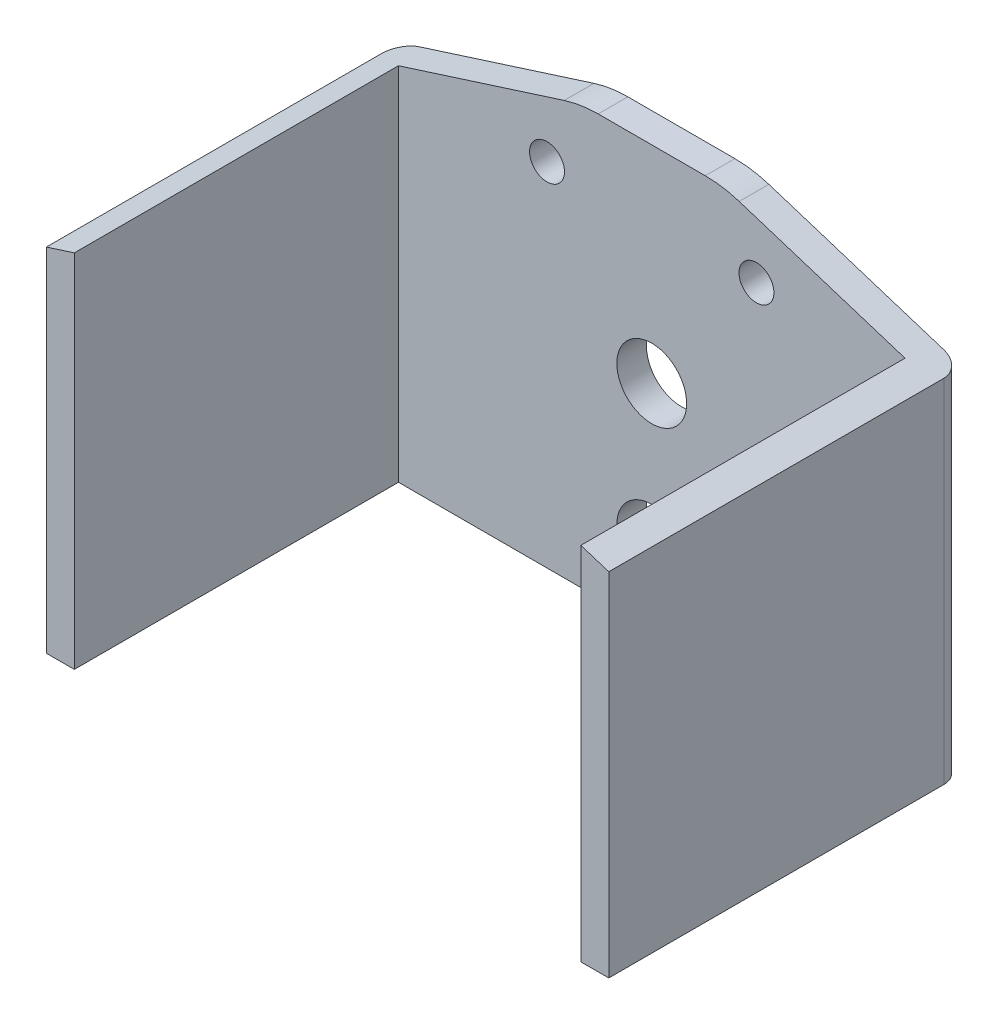
ISO-10303-21;
HEADER;
FILE_DESCRIPTION(('STEP AP214'),'2;1');
FILE_NAME('part.step','',(''),(''),'','','');
FILE_SCHEMA(('AUTOMOTIVE_DESIGN { 1 0 10303 214 1 1 1 1 }'));
ENDSEC;
DATA;
#1=APPLICATION_CONTEXT('core data for automotive mechanical design processes');
#2=APPLICATION_PROTOCOL_DEFINITION('international standard','automotive_design',2000,#1);
#3=PRODUCT_CONTEXT('',#1,'mechanical');
#4=PRODUCT('Part','Part','',(#3));
#5=PRODUCT_RELATED_PRODUCT_CATEGORY('part','',(#4));
#6=PRODUCT_DEFINITION_FORMATION('','',#4);
#7=PRODUCT_DEFINITION_CONTEXT('part definition',#1,'design');
#8=PRODUCT_DEFINITION('design','',#6,#7);
#9=PRODUCT_DEFINITION_SHAPE('','',#8);
#10=(LENGTH_UNIT() NAMED_UNIT(*) SI_UNIT(.MILLI.,.METRE.));
#11=(NAMED_UNIT(*) PLANE_ANGLE_UNIT() SI_UNIT($,.RADIAN.));
#12=(NAMED_UNIT(*) SI_UNIT($,.STERADIAN.) SOLID_ANGLE_UNIT());
#13=UNCERTAINTY_MEASURE_WITH_UNIT(LENGTH_MEASURE(1.E-05),#10,'distance_accuracy_value','');
#14=(GEOMETRIC_REPRESENTATION_CONTEXT(3) GLOBAL_UNCERTAINTY_ASSIGNED_CONTEXT((#13)) GLOBAL_UNIT_ASSIGNED_CONTEXT((#10,
#11,#12)) REPRESENTATION_CONTEXT('',''));
#15=CARTESIAN_POINT('',(0.,0.,0.));
#16=DIRECTION('',(0.,0.,1.));
#17=DIRECTION('',(1.,0.,0.));
#18=AXIS2_PLACEMENT_3D('',#15,#16,#17);
#19=CARTESIAN_POINT('',(-11.5187275160441,19.05,16.0907323942963));
#20=DIRECTION('',(-1.,0.,0.));
#21=DIRECTION('',(0.,0.,1.));
#22=AXIS2_PLACEMENT_3D('',#19,#20,#21);
#23=PLANE('',#22);
#24=DIRECTION('',(0.,-1.,0.));
#25=VECTOR('',#24,1.);
#26=CARTESIAN_POINT('',(-11.5187275160441,19.05,1.34814475605444));
#27=LINE('',#26,#25);
#28=CARTESIAN_POINT('',(-11.5187275160441,16.4067377666655,1.34814475605444));
#29=VERTEX_POINT('',#28);
#30=CARTESIAN_POINT('',(-11.5187275160441,0.,1.34814475605444));
#31=VERTEX_POINT('',#30);
#32=EDGE_CURVE('E187',#29,#31,#27,.T.);
#33=ORIENTED_EDGE('',*,*,#32,.F.);
#34=DIRECTION('',(0.,0.,1.));
#35=VECTOR('',#34,1.);
#36=CARTESIAN_POINT('',(-11.5187275160441,16.4067377666655,16.0907323942963));
#37=LINE('',#36,#35);
#38=CARTESIAN_POINT('',(-11.5187275160441,16.4067377666655,16.0907323942963));
#39=VERTEX_POINT('',#38);
#40=EDGE_CURVE('E242',#29,#39,#37,.T.);
#41=ORIENTED_EDGE('',*,*,#40,.T.);
#42=DIRECTION('',(0.,-1.,0.));
#43=VECTOR('',#42,1.);
#44=CARTESIAN_POINT('',(-11.5187275160441,19.05,16.0907323942963));
#45=LINE('',#44,#43);
#46=CARTESIAN_POINT('',(-11.5187275160441,0.,16.0907323942963));
#47=VERTEX_POINT('',#46);
#48=EDGE_CURVE('E161',#39,#47,#45,.T.);
#49=ORIENTED_EDGE('',*,*,#48,.T.);
#50=DIRECTION('',(0.,0.,-1.));
#51=VECTOR('',#50,1.);
#52=CARTESIAN_POINT('',(-11.5187275160441,0.,16.0907323942963));
#53=LINE('',#52,#51);
#54=EDGE_CURVE('E255',#47,#31,#53,.T.);
#55=ORIENTED_EDGE('',*,*,#54,.T.);
#56=EDGE_LOOP('',(#33,#41,#49,#55));
#57=FACE_BOUND('',#56,.T.);
#58=ADVANCED_FACE('F42',(#57),#23,.F.);
#59=CARTESIAN_POINT('',(-11.5187275160441,19.05,1.34814475605444));
#60=DIRECTION('',(0.,0.,-1.));
#61=DIRECTION('',(-1.,0.,0.));
#62=AXIS2_PLACEMENT_3D('',#59,#60,#61);
#63=PLANE('',#62);
#64=CARTESIAN_POINT('',(4.7625,16.002,1.34814475605444));
#65=DIRECTION('',(0.,0.,-1.));
#66=DIRECTION('',(-1.,0.,0.));
#67=AXIS2_PLACEMENT_3D('',#64,#65,#66);
#68=CIRCLE('',#67,0.79375);
#69=CARTESIAN_POINT('',(3.96875,16.002,1.34814475605444));
#70=VERTEX_POINT('',#69);
#71=EDGE_CURVE('E253',#70,#70,#68,.T.);
#72=ORIENTED_EDGE('',*,*,#71,.T.);
#73=EDGE_LOOP('',(#72));
#74=FACE_BOUND('',#73,.T.);
#75=CARTESIAN_POINT('',(0.,3.30200000000001,1.34814475605444));
#76=DIRECTION('',(0.,0.,-1.));
#77=DIRECTION('',(-1.,0.,0.));
#78=AXIS2_PLACEMENT_3D('',#75,#76,#77);
#79=CIRCLE('',#78,1.5875);
#80=CARTESIAN_POINT('',(-1.5875,3.30200000000001,1.34814475605444));
#81=VERTEX_POINT('',#80);
#82=EDGE_CURVE('E250',#81,#81,#79,.T.);
#83=ORIENTED_EDGE('',*,*,#82,.T.);
#84=EDGE_LOOP('',(#83));
#85=FACE_BOUND('',#84,.T.);
#86=CARTESIAN_POINT('',(0.,9.652,1.34814475605444));
#87=DIRECTION('',(0.,0.,-1.));
#88=DIRECTION('',(-1.,0.,0.));
#89=AXIS2_PLACEMENT_3D('',#86,#87,#88);
#90=CIRCLE('',#89,1.5875);
#91=CARTESIAN_POINT('',(-1.5875,9.652,1.34814475605444));
#92=VERTEX_POINT('',#91);
#93=EDGE_CURVE('E247',#92,#92,#90,.T.);
#94=ORIENTED_EDGE('',*,*,#93,.T.);
#95=EDGE_LOOP('',(#94));
#96=FACE_BOUND('',#95,.T.);
#97=CARTESIAN_POINT('',(-4.7625,16.002,1.34814475605444));
#98=DIRECTION('',(0.,0.,-1.));
#99=DIRECTION('',(-1.,0.,0.));
#100=AXIS2_PLACEMENT_3D('',#97,#98,#99);
#101=CIRCLE('',#100,0.793749999999999);
#102=CARTESIAN_POINT('',(-5.55625,16.002,1.34814475605444));
#103=VERTEX_POINT('',#102);
#104=EDGE_CURVE('E244',#103,#103,#101,.T.);
#105=ORIENTED_EDGE('',*,*,#104,.T.);
#106=EDGE_LOOP('',(#105));
#107=FACE_BOUND('',#106,.T.);
#108=DIRECTION('',(-0.952785800838437,0.303643240861145,0.));
#109=VECTOR('',#108,1.);
#110=CARTESIAN_POINT('',(-10.1594063672575,23.3153407520953,1.34814475605444));
#111=LINE('',#110,#109);
#112=CARTESIAN_POINT('',(11.5187323942963,16.4067362120157,1.34814475605444));
#113=VERTEX_POINT('',#112);
#114=CARTESIAN_POINT('',(3.97718362052046,18.8101518682593,1.34814475605444));
#115=VERTEX_POINT('',#114);
#116=EDGE_CURVE('E205',#113,#115,#111,.T.);
#117=ORIENTED_EDGE('',*,*,#116,.T.);
#118=CARTESIAN_POINT('',(2.43467595694584,13.97,1.34814475605444));
#119=DIRECTION('',(0.,0.,-1.));
#120=DIRECTION('',(-1.,0.,0.));
#121=AXIS2_PLACEMENT_3D('',#118,#119,#120);
#122=CIRCLE('',#121,5.08);
#123=CARTESIAN_POINT('',(2.43467595694584,19.05,1.34814475605444));
#124=VERTEX_POINT('',#123);
#125=EDGE_CURVE('E50',#115,#124,#122,.F.);
#126=ORIENTED_EDGE('',*,*,#125,.T.);
#127=DIRECTION('',(1.,0.,0.));
#128=VECTOR('',#127,1.);
#129=CARTESIAN_POINT('',(-11.5187275160441,19.05,1.34814475605444));
#130=LINE('',#129,#128);
#131=CARTESIAN_POINT('',(-2.43467595694584,19.05,1.34814475605444));
#132=VERTEX_POINT('',#131);
#133=EDGE_CURVE('E203',#132,#124,#130,.T.);
#134=ORIENTED_EDGE('',*,*,#133,.F.);
#135=CARTESIAN_POINT('',(-2.43467595694584,13.97,1.34814475605444));
#136=DIRECTION('',(0.,0.,-1.));
#137=DIRECTION('',(-1.,0.,0.));
#138=AXIS2_PLACEMENT_3D('',#135,#136,#137);
#139=CIRCLE('',#138,5.08);
#140=CARTESIAN_POINT('',(-3.97718362052045,18.8101518682593,1.34814475605444));
#141=VERTEX_POINT('',#140);
#142=EDGE_CURVE('E57',#132,#141,#139,.F.);
#143=ORIENTED_EDGE('',*,*,#142,.T.);
#144=DIRECTION('',(-0.952785800838437,-0.303643240861144,0.));
#145=VECTOR('',#144,1.);
#146=CARTESIAN_POINT('',(-10.7540133325974,16.6504444768095,1.34814475605444));
#147=LINE('',#146,#145);
#148=EDGE_CURVE('E240',#141,#29,#147,.T.);
#149=ORIENTED_EDGE('',*,*,#148,.T.);
#150=ORIENTED_EDGE('',*,*,#32,.T.);
#151=DIRECTION('',(1.,0.,0.));
#152=VECTOR('',#151,1.);
#153=CARTESIAN_POINT('',(-11.5187275160441,0.,1.34814475605444));
#154=LINE('',#153,#152);
#155=CARTESIAN_POINT('',(11.5187323942963,0.,1.34814475605444));
#156=VERTEX_POINT('',#155);
#157=EDGE_CURVE('E260',#31,#156,#154,.T.);
#158=ORIENTED_EDGE('',*,*,#157,.T.);
#159=DIRECTION('',(0.,-1.,0.));
#160=VECTOR('',#159,1.);
#161=CARTESIAN_POINT('',(11.5187323942963,19.05,1.34814475605444));
#162=LINE('',#161,#160);
#163=EDGE_CURVE('E185',#113,#156,#162,.T.);
#164=ORIENTED_EDGE('',*,*,#163,.F.);
#165=EDGE_LOOP('',(#117,#126,#134,#143,#149,#150,#158,#164));
#166=FACE_BOUND('',#165,.T.);
#167=ADVANCED_FACE('F202',(#74,#85,#96,#107,#166),#63,.F.);
#168=CARTESIAN_POINT('',(11.5187323942963,19.05,1.34814475605444));
#169=DIRECTION('',(1.,0.,0.));
#170=DIRECTION('',(0.,0.,-1.));
#171=AXIS2_PLACEMENT_3D('',#168,#169,#170);
#172=PLANE('',#171);
#173=DIRECTION('',(0.,-1.,0.));
#174=VECTOR('',#173,1.);
#175=CARTESIAN_POINT('',(11.5187323942963,19.05,16.0907323942963));
#176=LINE('',#175,#174);
#177=CARTESIAN_POINT('',(11.5187323942963,16.4067362120157,16.0907323942963));
#178=VERTEX_POINT('',#177);
#179=CARTESIAN_POINT('',(11.5187323942963,0.,16.0907323942963));
#180=VERTEX_POINT('',#179);
#181=EDGE_CURVE('E183',#178,#180,#176,.T.);
#182=ORIENTED_EDGE('',*,*,#181,.F.);
#183=DIRECTION('',(0.,0.,-1.));
#184=VECTOR('',#183,1.);
#185=CARTESIAN_POINT('',(11.5187323942963,16.4067362120157,1.34814475605444));
#186=LINE('',#185,#184);
#187=EDGE_CURVE('E235',#178,#113,#186,.T.);
#188=ORIENTED_EDGE('',*,*,#187,.T.);
#189=ORIENTED_EDGE('',*,*,#163,.T.);
#190=DIRECTION('',(0.,0.,1.));
#191=VECTOR('',#190,1.);
#192=CARTESIAN_POINT('',(11.5187323942963,0.,1.34814475605444));
#193=LINE('',#192,#191);
#194=EDGE_CURVE('E263',#156,#180,#193,.T.);
#195=ORIENTED_EDGE('',*,*,#194,.T.);
#196=EDGE_LOOP('',(#182,#188,#189,#195));
#197=FACE_BOUND('',#196,.T.);
#198=ADVANCED_FACE('F311',(#197),#172,.F.);
#199=CARTESIAN_POINT('',(11.5187323942963,19.05,16.0907323942963));
#200=DIRECTION('',(0.,0.,-1.));
#201=DIRECTION('',(-1.,0.,0.));
#202=AXIS2_PLACEMENT_3D('',#199,#200,#201);
#203=PLANE('',#202);
#204=DIRECTION('',(0.,-1.,0.));
#205=VECTOR('',#204,1.);
#206=CARTESIAN_POINT('',(12.7887323942963,19.05,16.0907323942963));
#207=LINE('',#206,#205);
#208=CARTESIAN_POINT('',(12.7887323942963,16.002,16.0907323942963));
#209=VERTEX_POINT('',#208);
#210=CARTESIAN_POINT('',(12.7887323942963,0.,16.0907323942963));
#211=VERTEX_POINT('',#210);
#212=EDGE_CURVE('E181',#209,#211,#207,.T.);
#213=ORIENTED_EDGE('',*,*,#212,.F.);
#214=DIRECTION('',(-0.952785800838437,0.303643240861145,0.));
#215=VECTOR('',#214,1.);
#216=CARTESIAN_POINT('',(12.7887323942963,16.002,16.0907323942963));
#217=LINE('',#216,#215);
#218=EDGE_CURVE('E225',#209,#178,#217,.T.);
#219=ORIENTED_EDGE('',*,*,#218,.T.);
#220=ORIENTED_EDGE('',*,*,#181,.T.);
#221=DIRECTION('',(1.,0.,0.));
#222=VECTOR('',#221,1.);
#223=CARTESIAN_POINT('',(11.5187323942963,0.,16.0907323942963));
#224=LINE('',#223,#222);
#225=EDGE_CURVE('E266',#180,#211,#224,.T.);
#226=ORIENTED_EDGE('',*,*,#225,.T.);
#227=EDGE_LOOP('',(#213,#219,#220,#226));
#228=FACE_BOUND('',#227,.T.);
#229=ADVANCED_FACE('F308',(#228),#203,.F.);
#230=CARTESIAN_POINT('',(12.7887323942963,19.05,0.850732394296316));
#231=DIRECTION('',(1.,0.,0.));
#232=DIRECTION('',(0.,0.,-1.));
#233=AXIS2_PLACEMENT_3D('',#230,#231,#232);
#234=PLANE('',#233);
#235=DIRECTION('',(0.,0.,-1.));
#236=VECTOR('',#235,1.);
#237=CARTESIAN_POINT('',(12.7887323942963,16.002,16.0907323942963));
#238=LINE('',#237,#236);
#239=CARTESIAN_POINT('',(12.7887323942963,16.002,0.850732394296314));
#240=VERTEX_POINT('',#239);
#241=EDGE_CURVE('E228',#209,#240,#238,.T.);
#242=ORIENTED_EDGE('',*,*,#241,.F.);
#243=ORIENTED_EDGE('',*,*,#212,.T.);
#244=DIRECTION('',(0.,0.,1.));
#245=VECTOR('',#244,1.);
#246=CARTESIAN_POINT('',(12.7887323942963,0.,0.850732394296316));
#247=LINE('',#246,#245);
#248=CARTESIAN_POINT('',(12.7887323942963,0.,0.850732394296316));
#249=VERTEX_POINT('',#248);
#250=EDGE_CURVE('E269',#249,#211,#247,.T.);
#251=ORIENTED_EDGE('',*,*,#250,.F.);
#252=DIRECTION('',(0.,-1.,0.));
#253=VECTOR('',#252,1.);
#254=CARTESIAN_POINT('',(12.7887323942963,19.05,0.850732394296316));
#255=LINE('',#254,#253);
#256=EDGE_CURVE('E179',#240,#249,#255,.T.);
#257=ORIENTED_EDGE('',*,*,#256,.F.);
#258=EDGE_LOOP('',(#242,#243,#251,#257));
#259=FACE_BOUND('',#258,.T.);
#260=ADVANCED_FACE('F305',(#259),#234,.T.);
#261=CARTESIAN_POINT('',(11.938,19.05,0.850732394296314));
#262=DIRECTION('',(0.,-1.,0.));
#263=DIRECTION('',(0.,0.,-1.));
#264=AXIS2_PLACEMENT_3D('',#261,#262,#263);
#265=CYLINDRICAL_SURFACE('',#264,0.850732394296315);
#266=CARTESIAN_POINT('',(11.938,16.2731198478004,0.850732394296314));
#267=DIRECTION('',(-0.303643240861145,-0.952785800838437,0.));
#268=DIRECTION('',(0.952785800838437,-0.303643240861145,0.));
#269=AXIS2_PLACEMENT_3D('',#266,#267,#268);
#270=ELLIPSE('',#269,0.892889454846707,0.850732394296315);
#271=CARTESIAN_POINT('',(11.938,16.2731198478004,0.));
#272=VERTEX_POINT('',#271);
#273=EDGE_CURVE('E224',#240,#272,#270,.F.);
#274=ORIENTED_EDGE('',*,*,#273,.F.);
#275=ORIENTED_EDGE('',*,*,#256,.T.);
#276=CARTESIAN_POINT('',(11.938,0.,0.850732394296314));
#277=DIRECTION('',(0.,-1.,0.));
#278=DIRECTION('',(0.,0.,-1.));
#279=AXIS2_PLACEMENT_3D('',#276,#277,#278);
#280=CIRCLE('',#279,0.850732394296315);
#281=CARTESIAN_POINT('',(11.938,0.,0.));
#282=VERTEX_POINT('',#281);
#283=EDGE_CURVE('E272',#282,#249,#280,.T.);
#284=ORIENTED_EDGE('',*,*,#283,.F.);
#285=DIRECTION('',(0.,-1.,0.));
#286=VECTOR('',#285,1.);
#287=CARTESIAN_POINT('',(11.938,19.05,0.));
#288=LINE('',#287,#286);
#289=EDGE_CURVE('E177',#272,#282,#288,.T.);
#290=ORIENTED_EDGE('',*,*,#289,.F.);
#291=EDGE_LOOP('',(#274,#275,#284,#290));
#292=FACE_BOUND('',#291,.T.);
#293=ADVANCED_FACE('F299',(#292),#265,.T.);
#294=CARTESIAN_POINT('',(-11.938,19.05,0.));
#295=DIRECTION('',(0.,0.,-1.));
#296=DIRECTION('',(-1.,0.,0.));
#297=AXIS2_PLACEMENT_3D('',#294,#295,#296);
#298=PLANE('',#297);
#299=CARTESIAN_POINT('',(4.7625,16.002,0.));
#300=DIRECTION('',(0.,0.,-1.));
#301=DIRECTION('',(-1.,0.,0.));
#302=AXIS2_PLACEMENT_3D('',#299,#300,#301);
#303=CIRCLE('',#302,0.79375);
#304=CARTESIAN_POINT('',(3.96875,16.002,0.));
#305=VERTEX_POINT('',#304);
#306=EDGE_CURVE('E488',#305,#305,#303,.T.);
#307=ORIENTED_EDGE('',*,*,#306,.F.);
#308=EDGE_LOOP('',(#307));
#309=FACE_BOUND('',#308,.T.);
#310=CARTESIAN_POINT('',(0.,3.30200000000001,0.));
#311=DIRECTION('',(0.,0.,-1.));
#312=DIRECTION('',(-1.,0.,0.));
#313=AXIS2_PLACEMENT_3D('',#310,#311,#312);
#314=CIRCLE('',#313,1.5875);
#315=CARTESIAN_POINT('',(-1.5875,3.30200000000001,0.));
#316=VERTEX_POINT('',#315);
#317=EDGE_CURVE('E490',#316,#316,#314,.T.);
#318=ORIENTED_EDGE('',*,*,#317,.F.);
#319=EDGE_LOOP('',(#318));
#320=FACE_BOUND('',#319,.T.);
#321=CARTESIAN_POINT('',(0.,9.652,0.));
#322=DIRECTION('',(0.,0.,-1.));
#323=DIRECTION('',(-1.,0.,0.));
#324=AXIS2_PLACEMENT_3D('',#321,#322,#323);
#325=CIRCLE('',#324,1.5875);
#326=CARTESIAN_POINT('',(-1.5875,9.652,0.));
#327=VERTEX_POINT('',#326);
#328=EDGE_CURVE('E153',#327,#327,#325,.T.);
#329=ORIENTED_EDGE('',*,*,#328,.F.);
#330=EDGE_LOOP('',(#329));
#331=FACE_BOUND('',#330,.T.);
#332=DIRECTION('',(1.,0.,0.));
#333=VECTOR('',#332,1.);
#334=CARTESIAN_POINT('',(-11.938,19.05,0.));
#335=LINE('',#334,#333);
#336=CARTESIAN_POINT('',(-2.43467595694584,19.05,0.));
#337=VERTEX_POINT('',#336);
#338=CARTESIAN_POINT('',(2.43467595694584,19.05,0.));
#339=VERTEX_POINT('',#338);
#340=EDGE_CURVE('E172',#337,#339,#335,.T.);
#341=ORIENTED_EDGE('',*,*,#340,.T.);
#342=CARTESIAN_POINT('',(2.43467595694584,13.97,0.));
#343=DIRECTION('',(0.,0.,-1.));
#344=DIRECTION('',(-1.,0.,0.));
#345=AXIS2_PLACEMENT_3D('',#342,#343,#344);
#346=CIRCLE('',#345,5.08);
#347=CARTESIAN_POINT('',(3.97718362052046,18.8101518682593,0.));
#348=VERTEX_POINT('',#347);
#349=EDGE_CURVE('E197',#339,#348,#346,.T.);
#350=ORIENTED_EDGE('',*,*,#349,.T.);
#351=DIRECTION('',(-0.952785800838437,0.303643240861145,0.));
#352=VECTOR('',#351,1.);
#353=CARTESIAN_POINT('',(12.7887323942963,16.002,0.));
#354=LINE('',#353,#352);
#355=EDGE_CURVE('E220',#272,#348,#354,.T.);
#356=ORIENTED_EDGE('',*,*,#355,.F.);
#357=ORIENTED_EDGE('',*,*,#289,.T.);
#358=DIRECTION('',(1.,0.,0.));
#359=VECTOR('',#358,1.);
#360=CARTESIAN_POINT('',(-11.938,0.,0.));
#361=LINE('',#360,#359);
#362=CARTESIAN_POINT('',(-11.938,0.,0.));
#363=VERTEX_POINT('',#362);
#364=EDGE_CURVE('E275',#363,#282,#361,.T.);
#365=ORIENTED_EDGE('',*,*,#364,.F.);
#366=DIRECTION('',(0.,-1.,0.));
#367=VECTOR('',#366,1.);
#368=CARTESIAN_POINT('',(-11.938,19.05,0.));
#369=LINE('',#368,#367);
#370=CARTESIAN_POINT('',(-11.938,16.2731198478004,6.09781522639078E-07));
#371=VERTEX_POINT('',#370);
#372=EDGE_CURVE('E170',#371,#363,#369,.T.);
#373=ORIENTED_EDGE('',*,*,#372,.F.);
#374=DIRECTION('',(-0.952785800838437,-0.303643240861144,0.));
#375=VECTOR('',#374,1.);
#376=CARTESIAN_POINT('',(-12.7887323942963,16.002,0.));
#377=LINE('',#376,#375);
#378=CARTESIAN_POINT('',(-3.97718362052045,18.8101518682593,0.));
#379=VERTEX_POINT('',#378);
#380=EDGE_CURVE('E162',#379,#371,#377,.T.);
#381=ORIENTED_EDGE('',*,*,#380,.F.);
#382=CARTESIAN_POINT('',(-2.43467595694584,13.97,0.));
#383=DIRECTION('',(0.,0.,-1.));
#384=DIRECTION('',(-1.,0.,0.));
#385=AXIS2_PLACEMENT_3D('',#382,#383,#384);
#386=CIRCLE('',#385,5.08);
#387=EDGE_CURVE('E195',#379,#337,#386,.T.);
#388=ORIENTED_EDGE('',*,*,#387,.T.);
#389=EDGE_LOOP('',(#341,#350,#356,#357,#365,#373,#381,#388));
#390=FACE_BOUND('',#389,.T.);
#391=CARTESIAN_POINT('',(-4.7625,16.002,0.));
#392=DIRECTION('',(0.,0.,-1.));
#393=DIRECTION('',(-1.,0.,0.));
#394=AXIS2_PLACEMENT_3D('',#391,#392,#393);
#395=CIRCLE('',#394,0.793749999999999);
#396=CARTESIAN_POINT('',(-5.55625,16.002,0.));
#397=VERTEX_POINT('',#396);
#398=EDGE_CURVE('E485',#397,#397,#395,.T.);
#399=ORIENTED_EDGE('',*,*,#398,.F.);
#400=EDGE_LOOP('',(#399));
#401=FACE_BOUND('',#400,.T.);
#402=ADVANCED_FACE('F218',(#309,#320,#331,#390,#401),#298,.T.);
#403=CARTESIAN_POINT('',(-11.938,19.05,0.850732394296315));
#404=DIRECTION('',(0.,-1.,0.));
#405=DIRECTION('',(0.,0.,-1.));
#406=AXIS2_PLACEMENT_3D('',#403,#404,#405);
#407=CYLINDRICAL_SURFACE('',#406,0.850729955170224);
#408=DIRECTION('',(0.,-1.,0.));
#409=VECTOR('',#408,1.);
#410=CARTESIAN_POINT('',(-12.7887299551702,19.05,0.850732394296315));
#411=LINE('',#410,#409);
#412=CARTESIAN_POINT('',(-12.7887323942963,16.002,0.850732394296314));
#413=VERTEX_POINT('',#412);
#414=CARTESIAN_POINT('',(-12.7887299551702,0.,0.850732394296315));
#415=VERTEX_POINT('',#414);
#416=EDGE_CURVE('E168',#413,#415,#411,.T.);
#417=ORIENTED_EDGE('',*,*,#416,.F.);
#418=CARTESIAN_POINT('',(-11.938,16.2731198478004,0.850732394296315));
#419=DIRECTION('',(0.303643240861144,-0.952785800838437,0.));
#420=DIRECTION('',(-0.952785800838437,-0.303643240861144,0.));
#421=AXIS2_PLACEMENT_3D('',#418,#419,#420);
#422=ELLIPSE('',#421,0.892886894852542,0.850729955170224);
#423=EDGE_CURVE('E149',#413,#371,#422,.T.);
#424=ORIENTED_EDGE('',*,*,#423,.T.);
#425=ORIENTED_EDGE('',*,*,#372,.T.);
#426=CARTESIAN_POINT('',(-11.938,0.,0.850732394296315));
#427=DIRECTION('',(0.,1.,0.));
#428=DIRECTION('',(0.,0.,1.));
#429=AXIS2_PLACEMENT_3D('',#426,#427,#428);
#430=CIRCLE('',#429,0.850729955170224);
#431=EDGE_CURVE('E278',#363,#415,#430,.T.);
#432=ORIENTED_EDGE('',*,*,#431,.T.);
#433=EDGE_LOOP('',(#417,#424,#425,#432));
#434=FACE_BOUND('',#433,.T.);
#435=ADVANCED_FACE('F295',(#434),#407,.T.);
#436=CARTESIAN_POINT('',(-12.7887275160441,19.05,0.850732394296315));
#437=DIRECTION('',(1.,0.,0.));
#438=DIRECTION('',(0.,0.,-1.));
#439=AXIS2_PLACEMENT_3D('',#436,#437,#438);
#440=PLANE('',#439);
#441=DIRECTION('',(0.,-1.,0.));
#442=VECTOR('',#441,1.);
#443=CARTESIAN_POINT('',(-12.7887275160441,19.05,16.0907323942963));
#444=LINE('',#443,#442);
#445=CARTESIAN_POINT('',(-12.7887323942963,16.002,16.0907323942963));
#446=VERTEX_POINT('',#445);
#447=CARTESIAN_POINT('',(-12.7887275160441,0.,16.0907323942963));
#448=VERTEX_POINT('',#447);
#449=EDGE_CURVE('E159',#446,#448,#444,.T.);
#450=ORIENTED_EDGE('',*,*,#449,.F.);
#451=DIRECTION('',(0.,0.,-1.));
#452=VECTOR('',#451,1.);
#453=CARTESIAN_POINT('',(-12.7887323942963,16.002,16.0907323942963));
#454=LINE('',#453,#452);
#455=EDGE_CURVE('E142',#446,#413,#454,.T.);
#456=ORIENTED_EDGE('',*,*,#455,.T.);
#457=ORIENTED_EDGE('',*,*,#416,.T.);
#458=DIRECTION('',(0.,0.,1.));
#459=VECTOR('',#458,1.);
#460=CARTESIAN_POINT('',(-12.7887275160441,0.,0.850732394296315));
#461=LINE('',#460,#459);
#462=EDGE_CURVE('E166',#415,#448,#461,.T.);
#463=ORIENTED_EDGE('',*,*,#462,.T.);
#464=EDGE_LOOP('',(#450,#456,#457,#463));
#465=FACE_BOUND('',#464,.T.);
#466=ADVANCED_FACE('F164',(#465),#440,.F.);
#467=CARTESIAN_POINT('',(-12.7887275160441,19.05,16.0907323942963));
#468=DIRECTION('',(0.,0.,-1.));
#469=DIRECTION('',(-1.,0.,0.));
#470=AXIS2_PLACEMENT_3D('',#467,#468,#469);
#471=PLANE('',#470);
#472=ORIENTED_EDGE('',*,*,#48,.F.);
#473=DIRECTION('',(-0.952785800838437,-0.303643240861144,0.));
#474=VECTOR('',#473,1.);
#475=CARTESIAN_POINT('',(-12.7887323942963,16.002,16.0907323942963));
#476=LINE('',#475,#474);
#477=EDGE_CURVE('E146',#39,#446,#476,.T.);
#478=ORIENTED_EDGE('',*,*,#477,.T.);
#479=ORIENTED_EDGE('',*,*,#449,.T.);
#480=DIRECTION('',(1.,0.,0.));
#481=VECTOR('',#480,1.);
#482=CARTESIAN_POINT('',(-12.7887275160441,0.,16.0907323942963));
#483=LINE('',#482,#481);
#484=EDGE_CURVE('E213',#448,#47,#483,.T.);
#485=ORIENTED_EDGE('',*,*,#484,.T.);
#486=EDGE_LOOP('',(#472,#478,#479,#485));
#487=FACE_BOUND('',#486,.T.);
#488=ADVANCED_FACE('F157',(#487),#471,.F.);
#489=CARTESIAN_POINT('',(11.938,19.05,0.850732394296314));
#490=DIRECTION('',(0.,-1.,0.));
#491=DIRECTION('',(0.,0.,-1.));
#492=AXIS2_PLACEMENT_3D('',#489,#490,#491);
#493=PLANE('',#492);
#494=ORIENTED_EDGE('',*,*,#133,.T.);
#495=DIRECTION('',(0.,0.,-1.));
#496=VECTOR('',#495,1.);
#497=CARTESIAN_POINT('',(2.43467595694584,19.05,0.850732394296314));
#498=LINE('',#497,#496);
#499=EDGE_CURVE('E192',#124,#339,#498,.T.);
#500=ORIENTED_EDGE('',*,*,#499,.T.);
#501=ORIENTED_EDGE('',*,*,#340,.F.);
#502=DIRECTION('',(0.,0.,1.));
#503=VECTOR('',#502,1.);
#504=CARTESIAN_POINT('',(-2.43467595694584,19.05,0.850732394296314));
#505=LINE('',#504,#503);
#506=EDGE_CURVE('E189',#337,#132,#505,.T.);
#507=ORIENTED_EDGE('',*,*,#506,.T.);
#508=EDGE_LOOP('',(#494,#500,#501,#507));
#509=FACE_BOUND('',#508,.T.);
#510=ADVANCED_FACE('F209',(#509),#493,.F.);
#511=CARTESIAN_POINT('',(11.938,0.,0.850732394296314));
#512=DIRECTION('',(0.,-1.,0.));
#513=DIRECTION('',(0.,0.,-1.));
#514=AXIS2_PLACEMENT_3D('',#511,#512,#513);
#515=PLANE('',#514);
#516=ORIENTED_EDGE('',*,*,#54,.F.);
#517=ORIENTED_EDGE('',*,*,#484,.F.);
#518=ORIENTED_EDGE('',*,*,#462,.F.);
#519=ORIENTED_EDGE('',*,*,#431,.F.);
#520=ORIENTED_EDGE('',*,*,#364,.T.);
#521=ORIENTED_EDGE('',*,*,#283,.T.);
#522=ORIENTED_EDGE('',*,*,#250,.T.);
#523=ORIENTED_EDGE('',*,*,#225,.F.);
#524=ORIENTED_EDGE('',*,*,#194,.F.);
#525=ORIENTED_EDGE('',*,*,#157,.F.);
#526=EDGE_LOOP('',(#516,#517,#518,#519,#520,#521,#522,#523,#524,#525));
#527=FACE_BOUND('',#526,.T.);
#528=ADVANCED_FACE('F284',(#527),#515,.T.);
#529=CARTESIAN_POINT('',(12.7887323942963,16.002,16.0907323942963));
#530=DIRECTION('',(-0.303643240861145,-0.952785800838437,0.));
#531=DIRECTION('',(0.952785800838437,-0.303643240861145,0.));
#532=AXIS2_PLACEMENT_3D('',#529,#530,#531);
#533=PLANE('',#532);
#534=ORIENTED_EDGE('',*,*,#355,.T.);
#535=DIRECTION('',(0.,0.,-1.));
#536=VECTOR('',#535,1.);
#537=CARTESIAN_POINT('',(3.97718362052046,18.8101518682593,16.0907323942963));
#538=LINE('',#537,#536);
#539=EDGE_CURVE('E65',#348,#115,#538,.F.);
#540=ORIENTED_EDGE('',*,*,#539,.T.);
#541=ORIENTED_EDGE('',*,*,#116,.F.);
#542=ORIENTED_EDGE('',*,*,#187,.F.);
#543=ORIENTED_EDGE('',*,*,#218,.F.);
#544=ORIENTED_EDGE('',*,*,#241,.T.);
#545=ORIENTED_EDGE('',*,*,#273,.T.);
#546=EDGE_LOOP('',(#534,#540,#541,#542,#543,#544,#545));
#547=FACE_BOUND('',#546,.T.);
#548=ADVANCED_FACE('F222',(#547),#533,.F.);
#549=CARTESIAN_POINT('',(-12.7887323942963,16.002,16.0907323942963));
#550=DIRECTION('',(0.303643240861144,-0.952785800838437,0.));
#551=DIRECTION('',(0.952785800838437,0.303643240861144,0.));
#552=AXIS2_PLACEMENT_3D('',#549,#550,#551);
#553=PLANE('',#552);
#554=ORIENTED_EDGE('',*,*,#148,.F.);
#555=DIRECTION('',(0.,0.,1.));
#556=VECTOR('',#555,1.);
#557=CARTESIAN_POINT('',(-3.97718362052046,18.8101518682593,16.0907323942963));
#558=LINE('',#557,#556);
#559=EDGE_CURVE('E11',#141,#379,#558,.F.);
#560=ORIENTED_EDGE('',*,*,#559,.T.);
#561=ORIENTED_EDGE('',*,*,#380,.T.);
#562=ORIENTED_EDGE('',*,*,#423,.F.);
#563=ORIENTED_EDGE('',*,*,#455,.F.);
#564=ORIENTED_EDGE('',*,*,#477,.F.);
#565=ORIENTED_EDGE('',*,*,#40,.F.);
#566=EDGE_LOOP('',(#554,#560,#561,#562,#563,#564,#565));
#567=FACE_BOUND('',#566,.T.);
#568=ADVANCED_FACE('F144',(#567),#553,.F.);
#569=CARTESIAN_POINT('',(-4.7625,16.002,16.0907323942963));
#570=DIRECTION('',(0.,0.,-1.));
#571=DIRECTION('',(-1.,0.,0.));
#572=AXIS2_PLACEMENT_3D('',#569,#570,#571);
#573=CYLINDRICAL_SURFACE('',#572,0.793749999999999);
#574=ORIENTED_EDGE('',*,*,#398,.T.);
#575=EDGE_LOOP('',(#574));
#576=FACE_BOUND('',#575,.T.);
#577=ORIENTED_EDGE('',*,*,#104,.F.);
#578=EDGE_LOOP('',(#577));
#579=FACE_BOUND('',#578,.T.);
#580=ADVANCED_FACE('F347',(#576,#579),#573,.F.);
#581=CARTESIAN_POINT('',(0.,9.652,16.0907323942963));
#582=DIRECTION('',(0.,0.,-1.));
#583=DIRECTION('',(-1.,0.,0.));
#584=AXIS2_PLACEMENT_3D('',#581,#582,#583);
#585=CYLINDRICAL_SURFACE('',#584,1.5875);
#586=ORIENTED_EDGE('',*,*,#328,.T.);
#587=EDGE_LOOP('',(#586));
#588=FACE_BOUND('',#587,.T.);
#589=ORIENTED_EDGE('',*,*,#93,.F.);
#590=EDGE_LOOP('',(#589));
#591=FACE_BOUND('',#590,.T.);
#592=ADVANCED_FACE('F339',(#588,#591),#585,.F.);
#593=CARTESIAN_POINT('',(0.,3.30200000000001,16.0907323942963));
#594=DIRECTION('',(0.,0.,-1.));
#595=DIRECTION('',(-1.,0.,0.));
#596=AXIS2_PLACEMENT_3D('',#593,#594,#595);
#597=CYLINDRICAL_SURFACE('',#596,1.5875);
#598=ORIENTED_EDGE('',*,*,#317,.T.);
#599=EDGE_LOOP('',(#598));
#600=FACE_BOUND('',#599,.T.);
#601=ORIENTED_EDGE('',*,*,#82,.F.);
#602=EDGE_LOOP('',(#601));
#603=FACE_BOUND('',#602,.T.);
#604=ADVANCED_FACE('F333',(#600,#603),#597,.F.);
#605=CARTESIAN_POINT('',(4.7625,16.002,16.0907323942963));
#606=DIRECTION('',(0.,0.,-1.));
#607=DIRECTION('',(-1.,0.,0.));
#608=AXIS2_PLACEMENT_3D('',#605,#606,#607);
#609=CYLINDRICAL_SURFACE('',#608,0.79375);
#610=ORIENTED_EDGE('',*,*,#306,.T.);
#611=EDGE_LOOP('',(#610));
#612=FACE_BOUND('',#611,.T.);
#613=ORIENTED_EDGE('',*,*,#71,.F.);
#614=EDGE_LOOP('',(#613));
#615=FACE_BOUND('',#614,.T.);
#616=ADVANCED_FACE('F327',(#612,#615),#609,.F.);
#617=CARTESIAN_POINT('',(2.43467595694584,13.97,0.850732394296314));
#618=DIRECTION('',(0.,0.,-1.));
#619=DIRECTION('',(-1.,0.,0.));
#620=AXIS2_PLACEMENT_3D('',#617,#618,#619);
#621=CYLINDRICAL_SURFACE('',#620,5.08);
#622=ORIENTED_EDGE('',*,*,#125,.F.);
#623=ORIENTED_EDGE('',*,*,#539,.F.);
#624=ORIENTED_EDGE('',*,*,#349,.F.);
#625=ORIENTED_EDGE('',*,*,#499,.F.);
#626=EDGE_LOOP('',(#622,#623,#624,#625));
#627=FACE_BOUND('',#626,.T.);
#628=ADVANCED_FACE('F215',(#627),#621,.T.);
#629=CARTESIAN_POINT('',(-2.43467595694584,13.97,0.850732394296314));
#630=DIRECTION('',(0.,0.,1.));
#631=DIRECTION('',(1.,0.,0.));
#632=AXIS2_PLACEMENT_3D('',#629,#630,#631);
#633=CYLINDRICAL_SURFACE('',#632,5.08);
#634=ORIENTED_EDGE('',*,*,#387,.F.);
#635=ORIENTED_EDGE('',*,*,#559,.F.);
#636=ORIENTED_EDGE('',*,*,#142,.F.);
#637=ORIENTED_EDGE('',*,*,#506,.F.);
#638=EDGE_LOOP('',(#634,#635,#636,#637));
#639=FACE_BOUND('',#638,.T.);
#640=ADVANCED_FACE('F44',(#639),#633,.T.);
#641=CLOSED_SHELL('',(#58,#167,#198,#229,#260,#293,#402,#435,#466,#488,#510,#528,#548,#568,#580,
#592,#604,#616,#628,#640));
#642=MANIFOLD_SOLID_BREP('B2',#641);
#643=ADVANCED_BREP_SHAPE_REPRESENTATION('',(#18,#642),#14);
#644=SHAPE_DEFINITION_REPRESENTATION(#9,#643);
ENDSEC;
END-ISO-10303-21;
